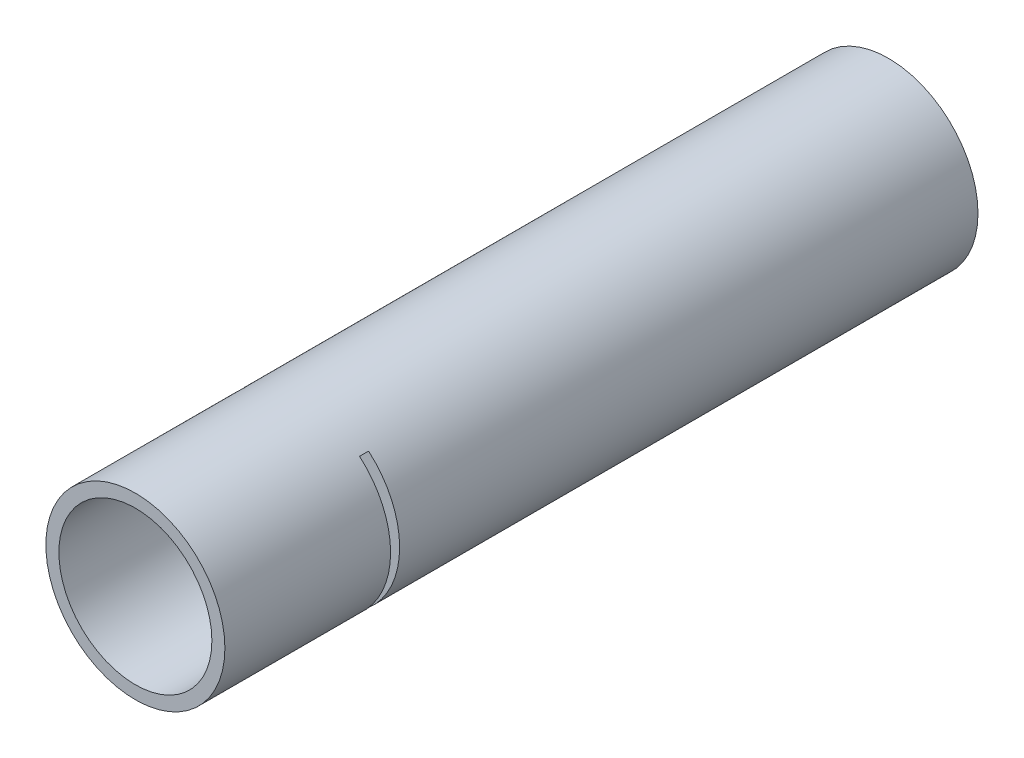
ISO-10303-21;
HEADER;
FILE_DESCRIPTION(('STEP AP214'),'2;1');
FILE_NAME('part.step','',(''),(''),'','','');
FILE_SCHEMA(('AUTOMOTIVE_DESIGN { 1 0 10303 214 1 1 1 1 }'));
ENDSEC;
DATA;
#1=APPLICATION_CONTEXT('core data for automotive mechanical design processes');
#2=APPLICATION_PROTOCOL_DEFINITION('international standard','automotive_design',2000,#1);
#3=PRODUCT_CONTEXT('',#1,'mechanical');
#4=PRODUCT('Part','Part','',(#3));
#5=PRODUCT_RELATED_PRODUCT_CATEGORY('part','',(#4));
#6=PRODUCT_DEFINITION_FORMATION('','',#4);
#7=PRODUCT_DEFINITION_CONTEXT('part definition',#1,'design');
#8=PRODUCT_DEFINITION('design','',#6,#7);
#9=PRODUCT_DEFINITION_SHAPE('','',#8);
#10=(LENGTH_UNIT() NAMED_UNIT(*) SI_UNIT(.MILLI.,.METRE.));
#11=(NAMED_UNIT(*) PLANE_ANGLE_UNIT() SI_UNIT($,.RADIAN.));
#12=(NAMED_UNIT(*) SI_UNIT($,.STERADIAN.) SOLID_ANGLE_UNIT());
#13=UNCERTAINTY_MEASURE_WITH_UNIT(LENGTH_MEASURE(1.E-05),#10,'distance_accuracy_value','');
#14=(GEOMETRIC_REPRESENTATION_CONTEXT(3) GLOBAL_UNCERTAINTY_ASSIGNED_CONTEXT((#13)) GLOBAL_UNIT_ASSIGNED_CONTEXT((#10,
#11,#12)) REPRESENTATION_CONTEXT('',''));
#15=CARTESIAN_POINT('',(0.,0.,0.));
#16=DIRECTION('',(0.,0.,1.));
#17=DIRECTION('',(1.,0.,0.));
#18=AXIS2_PLACEMENT_3D('',#15,#16,#17);
#19=CARTESIAN_POINT('',(0.,0.,250.));
#20=DIRECTION('',(0.,0.,1.));
#21=DIRECTION('',(1.,0.,0.));
#22=AXIS2_PLACEMENT_3D('',#19,#20,#21);
#23=PLANE('',#22);
#24=CARTESIAN_POINT('',(0.,0.,250.));
#25=DIRECTION('',(0.,0.,1.));
#26=DIRECTION('',(1.,0.,0.));
#27=AXIS2_PLACEMENT_3D('',#24,#25,#26);
#28=CIRCLE('',#27,29.72);
#29=CARTESIAN_POINT('',(29.72,0.,250.));
#30=VERTEX_POINT('',#29);
#31=EDGE_CURVE('E113',#30,#30,#28,.T.);
#32=ORIENTED_EDGE('',*,*,#31,.T.);
#33=EDGE_LOOP('',(#32));
#34=FACE_BOUND('',#33,.T.);
#35=CARTESIAN_POINT('',(0.,0.,250.));
#36=DIRECTION('',(0.,0.,1.));
#37=DIRECTION('',(1.,0.,0.));
#38=AXIS2_PLACEMENT_3D('',#35,#36,#37);
#39=CIRCLE('',#38,25.4);
#40=CARTESIAN_POINT('',(25.4,0.,250.));
#41=VERTEX_POINT('',#40);
#42=EDGE_CURVE('E169',#41,#41,#39,.T.);
#43=ORIENTED_EDGE('',*,*,#42,.F.);
#44=EDGE_LOOP('',(#43));
#45=FACE_BOUND('',#44,.T.);
#46=ADVANCED_FACE('F38',(#34,#45),#23,.T.);
#47=CARTESIAN_POINT('',(0.,0.,0.));
#48=DIRECTION('',(0.,0.,1.));
#49=DIRECTION('',(1.,0.,0.));
#50=AXIS2_PLACEMENT_3D('',#47,#48,#49);
#51=PLANE('',#50);
#52=CARTESIAN_POINT('',(0.,0.,0.));
#53=DIRECTION('',(0.,0.,1.));
#54=DIRECTION('',(1.,0.,0.));
#55=AXIS2_PLACEMENT_3D('',#52,#53,#54);
#56=CIRCLE('',#55,29.72);
#57=CARTESIAN_POINT('',(29.72,0.,0.));
#58=VERTEX_POINT('',#57);
#59=EDGE_CURVE('E172',#58,#58,#56,.T.);
#60=ORIENTED_EDGE('',*,*,#59,.F.);
#61=EDGE_LOOP('',(#60));
#62=FACE_BOUND('',#61,.T.);
#63=CARTESIAN_POINT('',(0.,0.,0.));
#64=DIRECTION('',(0.,0.,1.));
#65=DIRECTION('',(1.,0.,0.));
#66=AXIS2_PLACEMENT_3D('',#63,#64,#65);
#67=CIRCLE('',#66,25.4);
#68=CARTESIAN_POINT('',(25.4,0.,0.));
#69=VERTEX_POINT('',#68);
#70=EDGE_CURVE('E173',#69,#69,#67,.T.);
#71=ORIENTED_EDGE('',*,*,#70,.T.);
#72=EDGE_LOOP('',(#71));
#73=FACE_BOUND('',#72,.T.);
#74=ADVANCED_FACE('F182',(#62,#73),#51,.F.);
#75=CARTESIAN_POINT('',(0.,0.,250.));
#76=DIRECTION('',(0.,0.,-1.));
#77=DIRECTION('',(-1.,0.,0.));
#78=AXIS2_PLACEMENT_3D('',#75,#76,#77);
#79=CYLINDRICAL_SURFACE('',#78,29.72);
#80=DIRECTION('',(0.,0.,-1.));
#81=VECTOR('',#80,1.);
#82=CARTESIAN_POINT('',(-19.4172191623826,22.5,250.));
#83=LINE('',#82,#81);
#84=CARTESIAN_POINT('',(-19.4172191623826,22.5,192.));
#85=VERTEX_POINT('',#84);
#86=CARTESIAN_POINT('',(-19.4172191623826,22.5,195.));
#87=VERTEX_POINT('',#86);
#88=EDGE_CURVE('E147',#85,#87,#83,.F.);
#89=ORIENTED_EDGE('',*,*,#88,.T.);
#90=CARTESIAN_POINT('',(0.,0.,195.));
#91=DIRECTION('',(0.,0.,1.));
#92=DIRECTION('',(1.,0.,0.));
#93=AXIS2_PLACEMENT_3D('',#90,#91,#92);
#94=CIRCLE('',#93,29.72);
#95=CARTESIAN_POINT('',(-19.4172191623826,-22.5,195.));
#96=VERTEX_POINT('',#95);
#97=EDGE_CURVE('E119',#87,#96,#94,.T.);
#98=ORIENTED_EDGE('',*,*,#97,.T.);
#99=DIRECTION('',(0.,0.,-1.));
#100=VECTOR('',#99,1.);
#101=CARTESIAN_POINT('',(-19.4172191623826,-22.5,250.));
#102=LINE('',#101,#100);
#103=CARTESIAN_POINT('',(-19.4172191623826,-22.5,192.));
#104=VERTEX_POINT('',#103);
#105=EDGE_CURVE('E165',#96,#104,#102,.T.);
#106=ORIENTED_EDGE('',*,*,#105,.T.);
#107=CARTESIAN_POINT('',(0.,0.,192.));
#108=DIRECTION('',(0.,0.,-1.));
#109=DIRECTION('',(-1.,0.,0.));
#110=AXIS2_PLACEMENT_3D('',#107,#108,#109);
#111=CIRCLE('',#110,29.72);
#112=EDGE_CURVE('E143',#104,#85,#111,.T.);
#113=ORIENTED_EDGE('',*,*,#112,.T.);
#114=EDGE_LOOP('',(#89,#98,#106,#113));
#115=FACE_BOUND('',#114,.T.);
#116=CARTESIAN_POINT('',(19.4172191623826,-22.5,195.));
#117=VERTEX_POINT('',#116);
#118=CARTESIAN_POINT('',(19.4172191623826,22.5,195.));
#119=VERTEX_POINT('',#118);
#120=EDGE_CURVE('E160',#117,#119,#94,.T.);
#121=ORIENTED_EDGE('',*,*,#120,.T.);
#122=DIRECTION('',(0.,0.,-1.));
#123=VECTOR('',#122,1.);
#124=CARTESIAN_POINT('',(19.4172191623826,22.5,250.));
#125=LINE('',#124,#123);
#126=CARTESIAN_POINT('',(19.4172191623826,22.5,192.));
#127=VERTEX_POINT('',#126);
#128=EDGE_CURVE('E150',#119,#127,#125,.T.);
#129=ORIENTED_EDGE('',*,*,#128,.T.);
#130=CARTESIAN_POINT('',(19.4172191623826,-22.5,192.));
#131=VERTEX_POINT('',#130);
#132=EDGE_CURVE('E168',#127,#131,#111,.T.);
#133=ORIENTED_EDGE('',*,*,#132,.T.);
#134=DIRECTION('',(0.,0.,-1.));
#135=VECTOR('',#134,1.);
#136=CARTESIAN_POINT('',(19.4172191623826,-22.5,250.));
#137=LINE('',#136,#135);
#138=EDGE_CURVE('E162',#131,#117,#137,.F.);
#139=ORIENTED_EDGE('',*,*,#138,.T.);
#140=EDGE_LOOP('',(#121,#129,#133,#139));
#141=FACE_BOUND('',#140,.T.);
#142=ORIENTED_EDGE('',*,*,#31,.F.);
#143=EDGE_LOOP('',(#142));
#144=FACE_BOUND('',#143,.T.);
#145=ORIENTED_EDGE('',*,*,#59,.T.);
#146=EDGE_LOOP('',(#145));
#147=FACE_BOUND('',#146,.T.);
#148=ADVANCED_FACE('F40',(#115,#141,#144,#147),#79,.T.);
#149=CARTESIAN_POINT('',(0.,0.,250.));
#150=DIRECTION('',(0.,0.,-1.));
#151=DIRECTION('',(-1.,0.,0.));
#152=AXIS2_PLACEMENT_3D('',#149,#150,#151);
#153=CYLINDRICAL_SURFACE('',#152,25.4);
#154=CARTESIAN_POINT('',(0.,0.,192.));
#155=DIRECTION('',(0.,0.,-1.));
#156=DIRECTION('',(-1.,0.,0.));
#157=AXIS2_PLACEMENT_3D('',#154,#155,#156);
#158=CIRCLE('',#157,25.4);
#159=CARTESIAN_POINT('',(11.7860086543325,22.5,192.));
#160=VERTEX_POINT('',#159);
#161=CARTESIAN_POINT('',(11.7860086543325,-22.5,192.));
#162=VERTEX_POINT('',#161);
#163=EDGE_CURVE('E11',#160,#162,#158,.T.);
#164=ORIENTED_EDGE('',*,*,#163,.F.);
#165=DIRECTION('',(0.,0.,-1.));
#166=VECTOR('',#165,1.);
#167=CARTESIAN_POINT('',(11.7860086543325,22.5,250.));
#168=LINE('',#167,#166);
#169=CARTESIAN_POINT('',(11.7860086543325,22.5,195.));
#170=VERTEX_POINT('',#169);
#171=EDGE_CURVE('E132',#170,#160,#168,.T.);
#172=ORIENTED_EDGE('',*,*,#171,.F.);
#173=CARTESIAN_POINT('',(0.,0.,195.));
#174=DIRECTION('',(0.,0.,1.));
#175=DIRECTION('',(1.,0.,0.));
#176=AXIS2_PLACEMENT_3D('',#173,#174,#175);
#177=CIRCLE('',#176,25.4);
#178=CARTESIAN_POINT('',(11.7860086543325,-22.5,195.));
#179=VERTEX_POINT('',#178);
#180=EDGE_CURVE('E129',#179,#170,#177,.T.);
#181=ORIENTED_EDGE('',*,*,#180,.F.);
#182=DIRECTION('',(0.,0.,-1.));
#183=VECTOR('',#182,1.);
#184=CARTESIAN_POINT('',(11.7860086543325,-22.5,250.));
#185=LINE('',#184,#183);
#186=EDGE_CURVE('E42',#162,#179,#185,.F.);
#187=ORIENTED_EDGE('',*,*,#186,.F.);
#188=EDGE_LOOP('',(#164,#172,#181,#187));
#189=FACE_BOUND('',#188,.T.);
#190=CARTESIAN_POINT('',(-11.7860086543325,-22.5,192.));
#191=VERTEX_POINT('',#190);
#192=CARTESIAN_POINT('',(-11.7860086543325,22.5,192.));
#193=VERTEX_POINT('',#192);
#194=EDGE_CURVE('E48',#191,#193,#158,.T.);
#195=ORIENTED_EDGE('',*,*,#194,.F.);
#196=DIRECTION('',(0.,0.,-1.));
#197=VECTOR('',#196,1.);
#198=CARTESIAN_POINT('',(-11.7860086543325,-22.5,250.));
#199=LINE('',#198,#197);
#200=CARTESIAN_POINT('',(-11.7860086543325,-22.5,195.));
#201=VERTEX_POINT('',#200);
#202=EDGE_CURVE('E127',#201,#191,#199,.T.);
#203=ORIENTED_EDGE('',*,*,#202,.F.);
#204=CARTESIAN_POINT('',(-11.7860086543325,22.5,195.));
#205=VERTEX_POINT('',#204);
#206=EDGE_CURVE('E112',#205,#201,#177,.T.);
#207=ORIENTED_EDGE('',*,*,#206,.F.);
#208=DIRECTION('',(0.,0.,-1.));
#209=VECTOR('',#208,1.);
#210=CARTESIAN_POINT('',(-11.7860086543325,22.5,250.));
#211=LINE('',#210,#209);
#212=EDGE_CURVE('E104',#193,#205,#211,.F.);
#213=ORIENTED_EDGE('',*,*,#212,.F.);
#214=EDGE_LOOP('',(#195,#203,#207,#213));
#215=FACE_BOUND('',#214,.T.);
#216=ORIENTED_EDGE('',*,*,#42,.T.);
#217=EDGE_LOOP('',(#216));
#218=FACE_BOUND('',#217,.T.);
#219=ORIENTED_EDGE('',*,*,#70,.F.);
#220=EDGE_LOOP('',(#219));
#221=FACE_BOUND('',#220,.T.);
#222=ADVANCED_FACE('F125',(#189,#215,#218,#221),#153,.F.);
#223=CARTESIAN_POINT('',(-29.72,22.5,195.));
#224=DIRECTION('',(0.,1.,0.));
#225=DIRECTION('',(0.,0.,1.));
#226=AXIS2_PLACEMENT_3D('',#223,#224,#225);
#227=PLANE('',#226);
#228=DIRECTION('',(1.,0.,0.));
#229=VECTOR('',#228,1.);
#230=CARTESIAN_POINT('',(-29.72,22.5,192.));
#231=LINE('',#230,#229);
#232=EDGE_CURVE('E107',#85,#193,#231,.T.);
#233=ORIENTED_EDGE('',*,*,#232,.T.);
#234=ORIENTED_EDGE('',*,*,#212,.T.);
#235=DIRECTION('',(1.,0.,0.));
#236=VECTOR('',#235,1.);
#237=CARTESIAN_POINT('',(-29.72,22.5,195.));
#238=LINE('',#237,#236);
#239=EDGE_CURVE('E55',#87,#205,#238,.T.);
#240=ORIENTED_EDGE('',*,*,#239,.F.);
#241=ORIENTED_EDGE('',*,*,#88,.F.);
#242=EDGE_LOOP('',(#233,#234,#240,#241));
#243=FACE_BOUND('',#242,.T.);
#244=ADVANCED_FACE('F105',(#243),#227,.F.);
#245=CARTESIAN_POINT('',(-29.72,-22.5,195.));
#246=DIRECTION('',(0.,0.,1.));
#247=DIRECTION('',(1.,0.,0.));
#248=AXIS2_PLACEMENT_3D('',#245,#246,#247);
#249=PLANE('',#248);
#250=ORIENTED_EDGE('',*,*,#239,.T.);
#251=ORIENTED_EDGE('',*,*,#206,.T.);
#252=DIRECTION('',(1.,0.,0.));
#253=VECTOR('',#252,1.);
#254=CARTESIAN_POINT('',(-29.72,-22.5,195.));
#255=LINE('',#254,#253);
#256=EDGE_CURVE('E153',#96,#201,#255,.T.);
#257=ORIENTED_EDGE('',*,*,#256,.F.);
#258=ORIENTED_EDGE('',*,*,#97,.F.);
#259=EDGE_LOOP('',(#250,#251,#257,#258));
#260=FACE_BOUND('',#259,.T.);
#261=ADVANCED_FACE('F116',(#260),#249,.F.);
#262=CARTESIAN_POINT('',(-29.72,-22.5,195.));
#263=DIRECTION('',(0.,-1.,0.));
#264=DIRECTION('',(0.,0.,-1.));
#265=AXIS2_PLACEMENT_3D('',#262,#263,#264);
#266=PLANE('',#265);
#267=ORIENTED_EDGE('',*,*,#256,.T.);
#268=ORIENTED_EDGE('',*,*,#202,.T.);
#269=DIRECTION('',(1.,0.,0.));
#270=VECTOR('',#269,1.);
#271=CARTESIAN_POINT('',(-29.72,-22.5,192.));
#272=LINE('',#271,#270);
#273=EDGE_CURVE('E142',#104,#191,#272,.T.);
#274=ORIENTED_EDGE('',*,*,#273,.F.);
#275=ORIENTED_EDGE('',*,*,#105,.F.);
#276=EDGE_LOOP('',(#267,#268,#274,#275));
#277=FACE_BOUND('',#276,.T.);
#278=ADVANCED_FACE('F238',(#277),#266,.F.);
#279=CARTESIAN_POINT('',(-29.72,-22.5,192.));
#280=DIRECTION('',(0.,0.,-1.));
#281=DIRECTION('',(-1.,0.,0.));
#282=AXIS2_PLACEMENT_3D('',#279,#280,#281);
#283=PLANE('',#282);
#284=ORIENTED_EDGE('',*,*,#112,.F.);
#285=ORIENTED_EDGE('',*,*,#273,.T.);
#286=ORIENTED_EDGE('',*,*,#194,.T.);
#287=ORIENTED_EDGE('',*,*,#232,.F.);
#288=EDGE_LOOP('',(#284,#285,#286,#287));
#289=FACE_BOUND('',#288,.T.);
#290=ADVANCED_FACE('F140',(#289),#283,.F.);
#291=EDGE_CURVE('E63',#160,#127,#231,.T.);
#292=ORIENTED_EDGE('',*,*,#291,.F.);
#293=ORIENTED_EDGE('',*,*,#163,.T.);
#294=EDGE_CURVE('E148',#162,#131,#272,.T.);
#295=ORIENTED_EDGE('',*,*,#294,.T.);
#296=ORIENTED_EDGE('',*,*,#132,.F.);
#297=EDGE_LOOP('',(#292,#293,#295,#296));
#298=FACE_BOUND('',#297,.T.);
#299=ADVANCED_FACE('F257',(#298),#283,.F.);
#300=ORIENTED_EDGE('',*,*,#294,.F.);
#301=ORIENTED_EDGE('',*,*,#186,.T.);
#302=EDGE_CURVE('E121',#179,#117,#255,.T.);
#303=ORIENTED_EDGE('',*,*,#302,.T.);
#304=ORIENTED_EDGE('',*,*,#138,.F.);
#305=EDGE_LOOP('',(#300,#301,#303,#304));
#306=FACE_BOUND('',#305,.T.);
#307=ADVANCED_FACE('F249',(#306),#266,.F.);
#308=ORIENTED_EDGE('',*,*,#120,.F.);
#309=ORIENTED_EDGE('',*,*,#302,.F.);
#310=ORIENTED_EDGE('',*,*,#180,.T.);
#311=EDGE_CURVE('E122',#170,#119,#238,.T.);
#312=ORIENTED_EDGE('',*,*,#311,.T.);
#313=EDGE_LOOP('',(#308,#309,#310,#312));
#314=FACE_BOUND('',#313,.T.);
#315=ADVANCED_FACE('F240',(#314),#249,.F.);
#316=ORIENTED_EDGE('',*,*,#311,.F.);
#317=ORIENTED_EDGE('',*,*,#171,.T.);
#318=ORIENTED_EDGE('',*,*,#291,.T.);
#319=ORIENTED_EDGE('',*,*,#128,.F.);
#320=EDGE_LOOP('',(#316,#317,#318,#319));
#321=FACE_BOUND('',#320,.T.);
#322=ADVANCED_FACE('F195',(#321),#227,.F.);
#323=CLOSED_SHELL('',(#46,#74,#148,#222,#244,#261,#278,#290,#299,#307,#315,#322));
#324=MANIFOLD_SOLID_BREP('B2',#323);
#325=ADVANCED_BREP_SHAPE_REPRESENTATION('',(#18,#324),#14);
#326=SHAPE_DEFINITION_REPRESENTATION(#9,#325);
ENDSEC;
END-ISO-10303-21;
